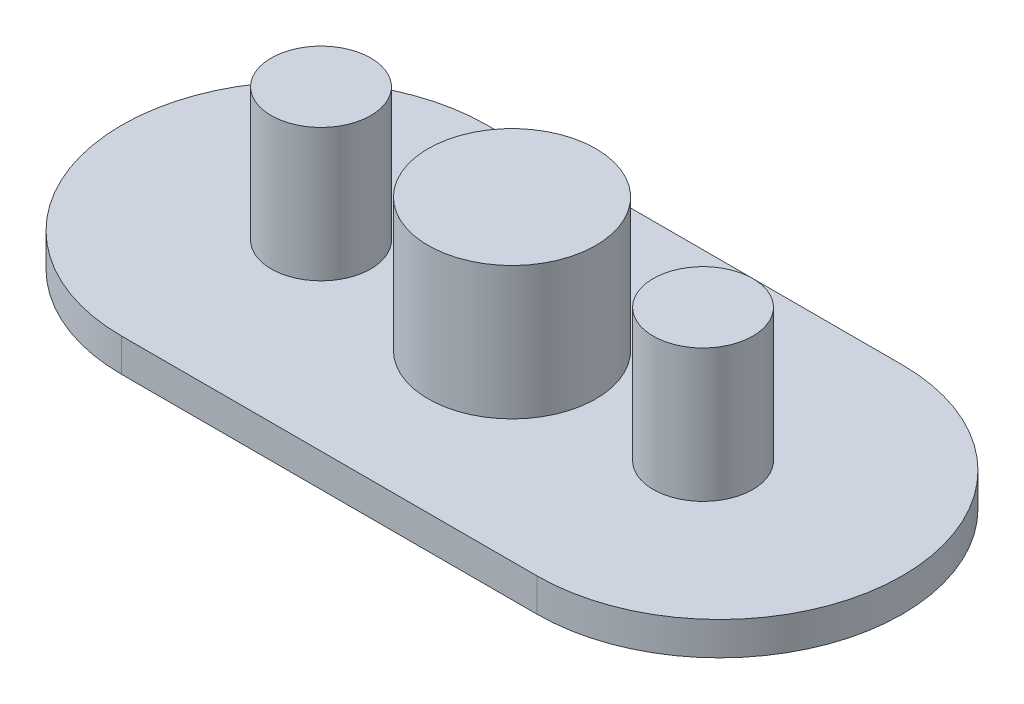
ISO-10303-21;
HEADER;
FILE_DESCRIPTION(('STEP AP214'),'2;1');
FILE_NAME('part.step','',(''),(''),'','','');
FILE_SCHEMA(('AUTOMOTIVE_DESIGN { 1 0 10303 214 1 1 1 1 }'));
ENDSEC;
DATA;
#1=APPLICATION_CONTEXT('core data for automotive mechanical design processes');
#2=APPLICATION_PROTOCOL_DEFINITION('international standard','automotive_design',2000,#1);
#3=PRODUCT_CONTEXT('',#1,'mechanical');
#4=PRODUCT('Part','Part','',(#3));
#5=PRODUCT_RELATED_PRODUCT_CATEGORY('part','',(#4));
#6=PRODUCT_DEFINITION_FORMATION('','',#4);
#7=PRODUCT_DEFINITION_CONTEXT('part definition',#1,'design');
#8=PRODUCT_DEFINITION('design','',#6,#7);
#9=PRODUCT_DEFINITION_SHAPE('','',#8);
#10=(LENGTH_UNIT() NAMED_UNIT(*) SI_UNIT(.MILLI.,.METRE.));
#11=(NAMED_UNIT(*) PLANE_ANGLE_UNIT() SI_UNIT($,.RADIAN.));
#12=(NAMED_UNIT(*) SI_UNIT($,.STERADIAN.) SOLID_ANGLE_UNIT());
#13=UNCERTAINTY_MEASURE_WITH_UNIT(LENGTH_MEASURE(1.E-05),#10,'distance_accuracy_value','');
#14=(GEOMETRIC_REPRESENTATION_CONTEXT(3) GLOBAL_UNCERTAINTY_ASSIGNED_CONTEXT((#13)) GLOBAL_UNIT_ASSIGNED_CONTEXT((#10,
#11,#12)) REPRESENTATION_CONTEXT('',''));
#15=CARTESIAN_POINT('',(0.,0.,0.));
#16=DIRECTION('',(0.,0.,1.));
#17=DIRECTION('',(1.,0.,0.));
#18=AXIS2_PLACEMENT_3D('',#15,#16,#17);
#19=CARTESIAN_POINT('',(12.5,-2.,0.));
#20=DIRECTION('',(0.,1.,0.));
#21=DIRECTION('',(0.,0.,1.));
#22=AXIS2_PLACEMENT_3D('',#19,#20,#21);
#23=CYLINDRICAL_SURFACE('',#22,11.);
#24=CARTESIAN_POINT('',(12.5,0.,0.));
#25=DIRECTION('',(0.,-1.,0.));
#26=DIRECTION('',(0.,0.,-1.));
#27=AXIS2_PLACEMENT_3D('',#24,#25,#26);
#28=CIRCLE('',#27,11.);
#29=CARTESIAN_POINT('',(12.5,0.,-11.));
#30=VERTEX_POINT('',#29);
#31=CARTESIAN_POINT('',(12.5,0.,11.));
#32=VERTEX_POINT('',#31);
#33=EDGE_CURVE('E113',#30,#32,#28,.T.);
#34=ORIENTED_EDGE('',*,*,#33,.T.);
#35=DIRECTION('',(0.,1.,0.));
#36=VECTOR('',#35,1.);
#37=CARTESIAN_POINT('',(12.5,-2.,11.));
#38=LINE('',#37,#36);
#39=CARTESIAN_POINT('',(12.5,-2.,11.));
#40=VERTEX_POINT('',#39);
#41=EDGE_CURVE('E11',#40,#32,#38,.T.);
#42=ORIENTED_EDGE('',*,*,#41,.F.);
#43=CARTESIAN_POINT('',(12.5,-2.,0.));
#44=DIRECTION('',(0.,-1.,0.));
#45=DIRECTION('',(0.,0.,-1.));
#46=AXIS2_PLACEMENT_3D('',#43,#44,#45);
#47=CIRCLE('',#46,11.);
#48=CARTESIAN_POINT('',(12.5,-2.,-11.));
#49=VERTEX_POINT('',#48);
#50=EDGE_CURVE('E97',#49,#40,#47,.T.);
#51=ORIENTED_EDGE('',*,*,#50,.F.);
#52=DIRECTION('',(0.,1.,0.));
#53=VECTOR('',#52,1.);
#54=CARTESIAN_POINT('',(12.5,-2.,-11.));
#55=LINE('',#54,#53);
#56=EDGE_CURVE('E109',#49,#30,#55,.T.);
#57=ORIENTED_EDGE('',*,*,#56,.T.);
#58=EDGE_LOOP('',(#34,#42,#51,#57));
#59=FACE_BOUND('',#58,.T.);
#60=ADVANCED_FACE('F45',(#59),#23,.T.);
#61=CARTESIAN_POINT('',(12.5,-2.,11.));
#62=DIRECTION('',(0.,0.,-1.));
#63=DIRECTION('',(-1.,0.,0.));
#64=AXIS2_PLACEMENT_3D('',#61,#62,#63);
#65=PLANE('',#64);
#66=DIRECTION('',(-1.,0.,0.));
#67=VECTOR('',#66,1.);
#68=CARTESIAN_POINT('',(12.5,0.,11.));
#69=LINE('',#68,#67);
#70=CARTESIAN_POINT('',(-12.5,0.,11.));
#71=VERTEX_POINT('',#70);
#72=EDGE_CURVE('E102',#32,#71,#69,.T.);
#73=ORIENTED_EDGE('',*,*,#72,.T.);
#74=DIRECTION('',(0.,1.,0.));
#75=VECTOR('',#74,1.);
#76=CARTESIAN_POINT('',(-12.5,-2.,11.));
#77=LINE('',#76,#75);
#78=CARTESIAN_POINT('',(-12.5,-2.,11.));
#79=VERTEX_POINT('',#78);
#80=EDGE_CURVE('E54',#79,#71,#77,.T.);
#81=ORIENTED_EDGE('',*,*,#80,.F.);
#82=DIRECTION('',(-1.,0.,0.));
#83=VECTOR('',#82,1.);
#84=CARTESIAN_POINT('',(12.5,-2.,11.));
#85=LINE('',#84,#83);
#86=EDGE_CURVE('E92',#40,#79,#85,.T.);
#87=ORIENTED_EDGE('',*,*,#86,.F.);
#88=ORIENTED_EDGE('',*,*,#41,.T.);
#89=EDGE_LOOP('',(#73,#81,#87,#88));
#90=FACE_BOUND('',#89,.T.);
#91=ADVANCED_FACE('F101',(#90),#65,.F.);
#92=CARTESIAN_POINT('',(-12.5,-2.,0.));
#93=DIRECTION('',(0.,1.,0.));
#94=DIRECTION('',(0.,0.,1.));
#95=AXIS2_PLACEMENT_3D('',#92,#93,#94);
#96=CYLINDRICAL_SURFACE('',#95,11.);
#97=CARTESIAN_POINT('',(-12.5,0.,0.));
#98=DIRECTION('',(0.,-1.,0.));
#99=DIRECTION('',(0.,0.,-1.));
#100=AXIS2_PLACEMENT_3D('',#97,#98,#99);
#101=CIRCLE('',#100,11.);
#102=CARTESIAN_POINT('',(-12.5,0.,-11.));
#103=VERTEX_POINT('',#102);
#104=EDGE_CURVE('E79',#71,#103,#101,.T.);
#105=ORIENTED_EDGE('',*,*,#104,.T.);
#106=DIRECTION('',(0.,1.,0.));
#107=VECTOR('',#106,1.);
#108=CARTESIAN_POINT('',(-12.5,-2.,-11.));
#109=LINE('',#108,#107);
#110=CARTESIAN_POINT('',(-12.5,-2.,-11.));
#111=VERTEX_POINT('',#110);
#112=EDGE_CURVE('E104',#111,#103,#109,.T.);
#113=ORIENTED_EDGE('',*,*,#112,.F.);
#114=CARTESIAN_POINT('',(-12.5,-2.,0.));
#115=DIRECTION('',(0.,-1.,0.));
#116=DIRECTION('',(0.,0.,-1.));
#117=AXIS2_PLACEMENT_3D('',#114,#115,#116);
#118=CIRCLE('',#117,11.);
#119=EDGE_CURVE('E95',#79,#111,#118,.T.);
#120=ORIENTED_EDGE('',*,*,#119,.F.);
#121=ORIENTED_EDGE('',*,*,#80,.T.);
#122=EDGE_LOOP('',(#105,#113,#120,#121));
#123=FACE_BOUND('',#122,.T.);
#124=ADVANCED_FACE('F105',(#123),#96,.T.);
#125=CARTESIAN_POINT('',(12.5,-2.,-11.));
#126=DIRECTION('',(0.,0.,1.));
#127=DIRECTION('',(1.,0.,0.));
#128=AXIS2_PLACEMENT_3D('',#125,#126,#127);
#129=PLANE('',#128);
#130=DIRECTION('',(1.,0.,0.));
#131=VECTOR('',#130,1.);
#132=CARTESIAN_POINT('',(12.5,0.,-11.));
#133=LINE('',#132,#131);
#134=EDGE_CURVE('E85',#103,#30,#133,.T.);
#135=ORIENTED_EDGE('',*,*,#134,.T.);
#136=ORIENTED_EDGE('',*,*,#56,.F.);
#137=DIRECTION('',(1.,0.,0.));
#138=VECTOR('',#137,1.);
#139=CARTESIAN_POINT('',(12.5,-2.,-11.));
#140=LINE('',#139,#138);
#141=EDGE_CURVE('E62',#111,#49,#140,.T.);
#142=ORIENTED_EDGE('',*,*,#141,.F.);
#143=ORIENTED_EDGE('',*,*,#112,.T.);
#144=EDGE_LOOP('',(#135,#136,#142,#143));
#145=FACE_BOUND('',#144,.T.);
#146=ADVANCED_FACE('F127',(#145),#129,.F.);
#147=CARTESIAN_POINT('',(12.5,-2.,0.));
#148=DIRECTION('',(0.,-1.,0.));
#149=DIRECTION('',(0.,0.,-1.));
#150=AXIS2_PLACEMENT_3D('',#147,#148,#149);
#151=PLANE('',#150);
#152=ORIENTED_EDGE('',*,*,#50,.T.);
#153=ORIENTED_EDGE('',*,*,#86,.T.);
#154=ORIENTED_EDGE('',*,*,#119,.T.);
#155=ORIENTED_EDGE('',*,*,#141,.T.);
#156=EDGE_LOOP('',(#152,#153,#154,#155));
#157=FACE_BOUND('',#156,.T.);
#158=ADVANCED_FACE('F93',(#157),#151,.T.);
#159=CARTESIAN_POINT('',(12.5,0.,0.));
#160=DIRECTION('',(0.,-1.,0.));
#161=DIRECTION('',(0.,0.,-1.));
#162=AXIS2_PLACEMENT_3D('',#159,#160,#161);
#163=PLANE('',#162);
#164=CARTESIAN_POINT('',(11.5,0.,0.));
#165=DIRECTION('',(0.,-1.,0.));
#166=DIRECTION('',(0.,0.,-1.));
#167=AXIS2_PLACEMENT_3D('',#164,#165,#166);
#168=CIRCLE('',#167,3.);
#169=CARTESIAN_POINT('',(11.5,0.,-2.99999999999999));
#170=VERTEX_POINT('',#169);
#171=EDGE_CURVE('E146',#170,#170,#168,.T.);
#172=ORIENTED_EDGE('',*,*,#171,.T.);
#173=EDGE_LOOP('',(#172));
#174=FACE_BOUND('',#173,.T.);
#175=CARTESIAN_POINT('',(0.,0.,0.));
#176=DIRECTION('',(0.,-1.,0.));
#177=DIRECTION('',(0.,0.,-1.));
#178=AXIS2_PLACEMENT_3D('',#175,#176,#177);
#179=CIRCLE('',#178,5.05);
#180=CARTESIAN_POINT('',(0.,0.,-5.05));
#181=VERTEX_POINT('',#180);
#182=EDGE_CURVE('E138',#181,#181,#179,.T.);
#183=ORIENTED_EDGE('',*,*,#182,.T.);
#184=EDGE_LOOP('',(#183));
#185=FACE_BOUND('',#184,.T.);
#186=CARTESIAN_POINT('',(-11.5,0.,0.));
#187=DIRECTION('',(0.,-1.,0.));
#188=DIRECTION('',(0.,0.,-1.));
#189=AXIS2_PLACEMENT_3D('',#186,#187,#188);
#190=CIRCLE('',#189,3.);
#191=CARTESIAN_POINT('',(-11.5,0.,-3.));
#192=VERTEX_POINT('',#191);
#193=EDGE_CURVE('E134',#192,#192,#190,.T.);
#194=ORIENTED_EDGE('',*,*,#193,.T.);
#195=EDGE_LOOP('',(#194));
#196=FACE_BOUND('',#195,.T.);
#197=ORIENTED_EDGE('',*,*,#33,.F.);
#198=ORIENTED_EDGE('',*,*,#134,.F.);
#199=ORIENTED_EDGE('',*,*,#104,.F.);
#200=ORIENTED_EDGE('',*,*,#72,.F.);
#201=EDGE_LOOP('',(#197,#198,#199,#200));
#202=FACE_BOUND('',#201,.T.);
#203=ADVANCED_FACE('F130',(#174,#185,#196,#202),#163,.F.);
#204=CARTESIAN_POINT('',(-11.5,8.,0.));
#205=DIRECTION('',(0.,-1.,0.));
#206=DIRECTION('',(0.,0.,-1.));
#207=AXIS2_PLACEMENT_3D('',#204,#205,#206);
#208=CYLINDRICAL_SURFACE('',#207,3.);
#209=CARTESIAN_POINT('',(-11.5,8.,0.));
#210=DIRECTION('',(0.,-1.,0.));
#211=DIRECTION('',(0.,0.,-1.));
#212=AXIS2_PLACEMENT_3D('',#209,#210,#211);
#213=CIRCLE('',#212,3.);
#214=CARTESIAN_POINT('',(-11.5,8.,-3.));
#215=VERTEX_POINT('',#214);
#216=EDGE_CURVE('E117',#215,#215,#213,.T.);
#217=ORIENTED_EDGE('',*,*,#216,.T.);
#218=EDGE_LOOP('',(#217));
#219=FACE_BOUND('',#218,.T.);
#220=ORIENTED_EDGE('',*,*,#193,.F.);
#221=EDGE_LOOP('',(#220));
#222=FACE_BOUND('',#221,.T.);
#223=ADVANCED_FACE('F188',(#219,#222),#208,.T.);
#224=CARTESIAN_POINT('',(-11.5,8.,0.));
#225=DIRECTION('',(0.,-1.,0.));
#226=DIRECTION('',(0.,0.,-1.));
#227=AXIS2_PLACEMENT_3D('',#224,#225,#226);
#228=PLANE('',#227);
#229=ORIENTED_EDGE('',*,*,#216,.F.);
#230=EDGE_LOOP('',(#229));
#231=FACE_BOUND('',#230,.T.);
#232=ADVANCED_FACE('F193',(#231),#228,.F.);
#233=CARTESIAN_POINT('',(0.,8.,0.));
#234=DIRECTION('',(0.,-1.,0.));
#235=DIRECTION('',(0.,0.,-1.));
#236=AXIS2_PLACEMENT_3D('',#233,#234,#235);
#237=CYLINDRICAL_SURFACE('',#236,5.05);
#238=CARTESIAN_POINT('',(0.,8.,0.));
#239=DIRECTION('',(0.,-1.,0.));
#240=DIRECTION('',(0.,0.,-1.));
#241=AXIS2_PLACEMENT_3D('',#238,#239,#240);
#242=CIRCLE('',#241,5.05);
#243=CARTESIAN_POINT('',(0.,8.,-5.05));
#244=VERTEX_POINT('',#243);
#245=EDGE_CURVE('E142',#244,#244,#242,.T.);
#246=ORIENTED_EDGE('',*,*,#245,.T.);
#247=EDGE_LOOP('',(#246));
#248=FACE_BOUND('',#247,.T.);
#249=ORIENTED_EDGE('',*,*,#182,.F.);
#250=EDGE_LOOP('',(#249));
#251=FACE_BOUND('',#250,.T.);
#252=ADVANCED_FACE('F172',(#248,#251),#237,.T.);
#253=CARTESIAN_POINT('',(0.,8.,0.));
#254=DIRECTION('',(0.,-1.,0.));
#255=DIRECTION('',(0.,0.,-1.));
#256=AXIS2_PLACEMENT_3D('',#253,#254,#255);
#257=PLANE('',#256);
#258=ORIENTED_EDGE('',*,*,#245,.F.);
#259=EDGE_LOOP('',(#258));
#260=FACE_BOUND('',#259,.T.);
#261=ADVANCED_FACE('F163',(#260),#257,.F.);
#262=CARTESIAN_POINT('',(11.5,8.,0.));
#263=DIRECTION('',(0.,-1.,0.));
#264=DIRECTION('',(0.,0.,-1.));
#265=AXIS2_PLACEMENT_3D('',#262,#263,#264);
#266=CYLINDRICAL_SURFACE('',#265,3.);
#267=CARTESIAN_POINT('',(11.5,8.,0.));
#268=DIRECTION('',(0.,-1.,0.));
#269=DIRECTION('',(0.,0.,-1.));
#270=AXIS2_PLACEMENT_3D('',#267,#268,#269);
#271=CIRCLE('',#270,3.);
#272=CARTESIAN_POINT('',(11.5,8.,-2.99999999999999));
#273=VERTEX_POINT('',#272);
#274=EDGE_CURVE('E150',#273,#273,#271,.T.);
#275=ORIENTED_EDGE('',*,*,#274,.T.);
#276=EDGE_LOOP('',(#275));
#277=FACE_BOUND('',#276,.T.);
#278=ORIENTED_EDGE('',*,*,#171,.F.);
#279=EDGE_LOOP('',(#278));
#280=FACE_BOUND('',#279,.T.);
#281=ADVANCED_FACE('F160',(#277,#280),#266,.T.);
#282=CARTESIAN_POINT('',(11.5,8.,0.));
#283=DIRECTION('',(0.,-1.,0.));
#284=DIRECTION('',(0.,0.,-1.));
#285=AXIS2_PLACEMENT_3D('',#282,#283,#284);
#286=PLANE('',#285);
#287=ORIENTED_EDGE('',*,*,#274,.F.);
#288=EDGE_LOOP('',(#287));
#289=FACE_BOUND('',#288,.T.);
#290=ADVANCED_FACE('F162',(#289),#286,.F.);
#291=CLOSED_SHELL('',(#60,#91,#124,#146,#158,#203,#223,#232,#252,#261,#281,#290));
#292=MANIFOLD_SOLID_BREP('B2',#291);
#293=ADVANCED_BREP_SHAPE_REPRESENTATION('',(#18,#292),#14);
#294=SHAPE_DEFINITION_REPRESENTATION(#9,#293);
ENDSEC;
END-ISO-10303-21;
